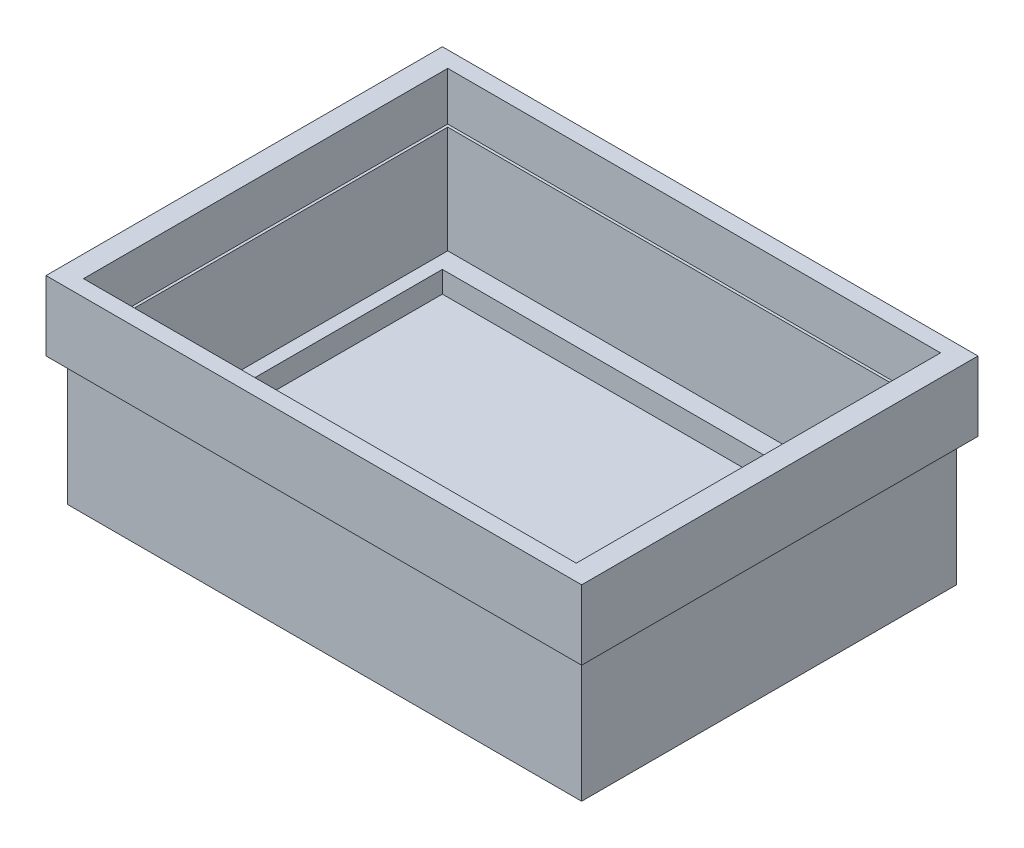
ISO-10303-21;
HEADER;
FILE_DESCRIPTION(('STEP AP214'),'2;1');
FILE_NAME('part.step','',(''),(''),'','','');
FILE_SCHEMA(('AUTOMOTIVE_DESIGN { 1 0 10303 214 1 1 1 1 }'));
ENDSEC;
DATA;
#1=APPLICATION_CONTEXT('core data for automotive mechanical design processes');
#2=APPLICATION_PROTOCOL_DEFINITION('international standard','automotive_design',2000,#1);
#3=PRODUCT_CONTEXT('',#1,'mechanical');
#4=PRODUCT('Part','Part','',(#3));
#5=PRODUCT_RELATED_PRODUCT_CATEGORY('part','',(#4));
#6=PRODUCT_DEFINITION_FORMATION('','',#4);
#7=PRODUCT_DEFINITION_CONTEXT('part definition',#1,'design');
#8=PRODUCT_DEFINITION('design','',#6,#7);
#9=PRODUCT_DEFINITION_SHAPE('','',#8);
#10=(LENGTH_UNIT() NAMED_UNIT(*) SI_UNIT(.MILLI.,.METRE.));
#11=(NAMED_UNIT(*) PLANE_ANGLE_UNIT() SI_UNIT($,.RADIAN.));
#12=(NAMED_UNIT(*) SI_UNIT($,.STERADIAN.) SOLID_ANGLE_UNIT());
#13=UNCERTAINTY_MEASURE_WITH_UNIT(LENGTH_MEASURE(1.E-05),#10,'distance_accuracy_value','');
#14=(GEOMETRIC_REPRESENTATION_CONTEXT(3) GLOBAL_UNCERTAINTY_ASSIGNED_CONTEXT((#13)) GLOBAL_UNIT_ASSIGNED_CONTEXT((#10,
#11,#12)) REPRESENTATION_CONTEXT('',''));
#15=CARTESIAN_POINT('',(0.,0.,0.));
#16=DIRECTION('',(0.,0.,1.));
#17=DIRECTION('',(1.,0.,0.));
#18=AXIS2_PLACEMENT_3D('',#15,#16,#17);
#19=CARTESIAN_POINT('',(0.,120.,0.));
#20=DIRECTION('',(0.,1.,0.));
#21=DIRECTION('',(0.,0.,1.));
#22=AXIS2_PLACEMENT_3D('',#19,#20,#21);
#23=PLANE('',#22);
#24=DIRECTION('',(0.,0.,-1.));
#25=VECTOR('',#24,1.);
#26=CARTESIAN_POINT('',(227.5,120.,167.5));
#27=LINE('',#26,#25);
#28=CARTESIAN_POINT('',(227.5,120.,167.5));
#29=VERTEX_POINT('',#28);
#30=CARTESIAN_POINT('',(227.5,120.,-167.5));
#31=VERTEX_POINT('',#30);
#32=EDGE_CURVE('E55',#29,#31,#27,.T.);
#33=ORIENTED_EDGE('',*,*,#32,.F.);
#34=DIRECTION('',(1.,0.,0.));
#35=VECTOR('',#34,1.);
#36=CARTESIAN_POINT('',(-227.5,120.,167.5));
#37=LINE('',#36,#35);
#38=CARTESIAN_POINT('',(-227.5,120.,167.5));
#39=VERTEX_POINT('',#38);
#40=EDGE_CURVE('E199',#39,#29,#37,.T.);
#41=ORIENTED_EDGE('',*,*,#40,.F.);
#42=DIRECTION('',(0.,0.,1.));
#43=VECTOR('',#42,1.);
#44=CARTESIAN_POINT('',(-227.5,120.,167.5));
#45=LINE('',#44,#43);
#46=CARTESIAN_POINT('',(-227.5,120.,-167.5));
#47=VERTEX_POINT('',#46);
#48=EDGE_CURVE('E203',#47,#39,#45,.T.);
#49=ORIENTED_EDGE('',*,*,#48,.F.);
#50=DIRECTION('',(-1.,0.,0.));
#51=VECTOR('',#50,1.);
#52=CARTESIAN_POINT('',(-227.5,120.,-167.5));
#53=LINE('',#52,#51);
#54=EDGE_CURVE('E212',#31,#47,#53,.T.);
#55=ORIENTED_EDGE('',*,*,#54,.F.);
#56=EDGE_LOOP('',(#33,#41,#49,#55));
#57=FACE_BOUND('',#56,.T.);
#58=DIRECTION('',(1.,0.,0.));
#59=VECTOR('',#58,1.);
#60=CARTESIAN_POINT('',(-230.,120.,170.));
#61=LINE('',#60,#59);
#62=CARTESIAN_POINT('',(-230.,120.,170.));
#63=VERTEX_POINT('',#62);
#64=CARTESIAN_POINT('',(230.,120.,170.));
#65=VERTEX_POINT('',#64);
#66=EDGE_CURVE('E296',#63,#65,#61,.T.);
#67=ORIENTED_EDGE('',*,*,#66,.T.);
#68=DIRECTION('',(0.,0.,-1.));
#69=VECTOR('',#68,1.);
#70=CARTESIAN_POINT('',(230.,120.,-170.));
#71=LINE('',#70,#69);
#72=CARTESIAN_POINT('',(230.,120.,-170.));
#73=VERTEX_POINT('',#72);
#74=EDGE_CURVE('E291',#65,#73,#71,.T.);
#75=ORIENTED_EDGE('',*,*,#74,.T.);
#76=DIRECTION('',(-1.,0.,0.));
#77=VECTOR('',#76,1.);
#78=CARTESIAN_POINT('',(-230.,120.,-170.));
#79=LINE('',#78,#77);
#80=CARTESIAN_POINT('',(-230.,120.,-170.));
#81=VERTEX_POINT('',#80);
#82=EDGE_CURVE('E310',#73,#81,#79,.T.);
#83=ORIENTED_EDGE('',*,*,#82,.T.);
#84=DIRECTION('',(0.,0.,1.));
#85=VECTOR('',#84,1.);
#86=CARTESIAN_POINT('',(-230.,120.,-170.));
#87=LINE('',#86,#85);
#88=EDGE_CURVE('E314',#81,#63,#87,.T.);
#89=ORIENTED_EDGE('',*,*,#88,.T.);
#90=EDGE_LOOP('',(#67,#75,#83,#89));
#91=FACE_BOUND('',#90,.T.);
#92=ADVANCED_FACE('F39',(#57,#91),#23,.T.);
#93=CARTESIAN_POINT('',(250.,120.,-185.));
#94=DIRECTION('',(-1.,0.,0.));
#95=DIRECTION('',(0.,0.,1.));
#96=AXIS2_PLACEMENT_3D('',#93,#94,#95);
#97=PLANE('',#96);
#98=DIRECTION('',(0.,-1.,0.));
#99=VECTOR('',#98,1.);
#100=CARTESIAN_POINT('',(250.,120.,185.));
#101=LINE('',#100,#99);
#102=CARTESIAN_POINT('',(250.,165.,185.));
#103=VERTEX_POINT('',#102);
#104=CARTESIAN_POINT('',(250.,100.,185.));
#105=VERTEX_POINT('',#104);
#106=EDGE_CURVE('E377',#103,#105,#101,.T.);
#107=ORIENTED_EDGE('',*,*,#106,.T.);
#108=DIRECTION('',(0.,0.,1.));
#109=VECTOR('',#108,1.);
#110=CARTESIAN_POINT('',(250.,100.,-185.));
#111=LINE('',#110,#109);
#112=CARTESIAN_POINT('',(250.,100.,-185.));
#113=VERTEX_POINT('',#112);
#114=EDGE_CURVE('E270',#113,#105,#111,.T.);
#115=ORIENTED_EDGE('',*,*,#114,.F.);
#116=DIRECTION('',(0.,-1.,0.));
#117=VECTOR('',#116,1.);
#118=CARTESIAN_POINT('',(250.,120.,-185.));
#119=LINE('',#118,#117);
#120=CARTESIAN_POINT('',(250.,165.,-185.));
#121=VERTEX_POINT('',#120);
#122=EDGE_CURVE('E48',#121,#113,#119,.T.);
#123=ORIENTED_EDGE('',*,*,#122,.F.);
#124=DIRECTION('',(0.,0.,-1.));
#125=VECTOR('',#124,1.);
#126=CARTESIAN_POINT('',(250.,165.,-185.));
#127=LINE('',#126,#125);
#128=EDGE_CURVE('E333',#103,#121,#127,.T.);
#129=ORIENTED_EDGE('',*,*,#128,.F.);
#130=EDGE_LOOP('',(#107,#115,#123,#129));
#131=FACE_BOUND('',#130,.T.);
#132=ADVANCED_FACE('F41',(#131),#97,.F.);
#133=CARTESIAN_POINT('',(-250.,120.,-185.));
#134=DIRECTION('',(0.,0.,1.));
#135=DIRECTION('',(1.,0.,0.));
#136=AXIS2_PLACEMENT_3D('',#133,#134,#135);
#137=PLANE('',#136);
#138=ORIENTED_EDGE('',*,*,#122,.T.);
#139=DIRECTION('',(1.,0.,0.));
#140=VECTOR('',#139,1.);
#141=CARTESIAN_POINT('',(-250.,100.,-185.));
#142=LINE('',#141,#140);
#143=CARTESIAN_POINT('',(-250.,100.,-185.));
#144=VERTEX_POINT('',#143);
#145=EDGE_CURVE('E288',#144,#113,#142,.T.);
#146=ORIENTED_EDGE('',*,*,#145,.F.);
#147=DIRECTION('',(0.,-1.,0.));
#148=VECTOR('',#147,1.);
#149=CARTESIAN_POINT('',(-250.,120.,-185.));
#150=LINE('',#149,#148);
#151=CARTESIAN_POINT('',(-250.,165.,-185.));
#152=VERTEX_POINT('',#151);
#153=EDGE_CURVE('E385',#152,#144,#150,.T.);
#154=ORIENTED_EDGE('',*,*,#153,.F.);
#155=DIRECTION('',(-1.,0.,0.));
#156=VECTOR('',#155,1.);
#157=CARTESIAN_POINT('',(-250.,165.,-185.));
#158=LINE('',#157,#156);
#159=EDGE_CURVE('E337',#121,#152,#158,.T.);
#160=ORIENTED_EDGE('',*,*,#159,.F.);
#161=EDGE_LOOP('',(#138,#146,#154,#160));
#162=FACE_BOUND('',#161,.T.);
#163=ADVANCED_FACE('F393',(#162),#137,.F.);
#164=CARTESIAN_POINT('',(-250.,120.,-185.));
#165=DIRECTION('',(1.,0.,0.));
#166=DIRECTION('',(0.,0.,-1.));
#167=AXIS2_PLACEMENT_3D('',#164,#165,#166);
#168=PLANE('',#167);
#169=ORIENTED_EDGE('',*,*,#153,.T.);
#170=DIRECTION('',(0.,0.,-1.));
#171=VECTOR('',#170,1.);
#172=CARTESIAN_POINT('',(-250.,100.,-185.));
#173=LINE('',#172,#171);
#174=CARTESIAN_POINT('',(-250.,100.,185.));
#175=VERTEX_POINT('',#174);
#176=EDGE_CURVE('E285',#175,#144,#173,.T.);
#177=ORIENTED_EDGE('',*,*,#176,.F.);
#178=DIRECTION('',(0.,-1.,0.));
#179=VECTOR('',#178,1.);
#180=CARTESIAN_POINT('',(-250.,120.,185.));
#181=LINE('',#180,#179);
#182=CARTESIAN_POINT('',(-250.,165.,185.));
#183=VERTEX_POINT('',#182);
#184=EDGE_CURVE('E381',#183,#175,#181,.T.);
#185=ORIENTED_EDGE('',*,*,#184,.F.);
#186=DIRECTION('',(0.,0.,1.));
#187=VECTOR('',#186,1.);
#188=CARTESIAN_POINT('',(-250.,165.,-185.));
#189=LINE('',#188,#187);
#190=EDGE_CURVE('E341',#152,#183,#189,.T.);
#191=ORIENTED_EDGE('',*,*,#190,.F.);
#192=EDGE_LOOP('',(#169,#177,#185,#191));
#193=FACE_BOUND('',#192,.T.);
#194=ADVANCED_FACE('F406',(#193),#168,.F.);
#195=CARTESIAN_POINT('',(-250.,120.,185.));
#196=DIRECTION('',(0.,0.,-1.));
#197=DIRECTION('',(-1.,0.,0.));
#198=AXIS2_PLACEMENT_3D('',#195,#196,#197);
#199=PLANE('',#198);
#200=ORIENTED_EDGE('',*,*,#184,.T.);
#201=DIRECTION('',(-1.,0.,0.));
#202=VECTOR('',#201,1.);
#203=CARTESIAN_POINT('',(-250.,100.,185.));
#204=LINE('',#203,#202);
#205=EDGE_CURVE('E282',#105,#175,#204,.T.);
#206=ORIENTED_EDGE('',*,*,#205,.F.);
#207=ORIENTED_EDGE('',*,*,#106,.F.);
#208=DIRECTION('',(1.,0.,0.));
#209=VECTOR('',#208,1.);
#210=CARTESIAN_POINT('',(-250.,165.,185.));
#211=LINE('',#210,#209);
#212=EDGE_CURVE('E345',#183,#103,#211,.T.);
#213=ORIENTED_EDGE('',*,*,#212,.F.);
#214=EDGE_LOOP('',(#200,#206,#207,#213));
#215=FACE_BOUND('',#214,.T.);
#216=ADVANCED_FACE('F402',(#215),#199,.F.);
#217=CARTESIAN_POINT('',(0.,165.,0.));
#218=DIRECTION('',(0.,1.,0.));
#219=DIRECTION('',(0.,0.,1.));
#220=AXIS2_PLACEMENT_3D('',#217,#218,#219);
#221=PLANE('',#220);
#222=ORIENTED_EDGE('',*,*,#128,.T.);
#223=ORIENTED_EDGE('',*,*,#159,.T.);
#224=ORIENTED_EDGE('',*,*,#190,.T.);
#225=ORIENTED_EDGE('',*,*,#212,.T.);
#226=EDGE_LOOP('',(#222,#223,#224,#225));
#227=FACE_BOUND('',#226,.T.);
#228=DIRECTION('',(-1.,0.,0.));
#229=VECTOR('',#228,1.);
#230=CARTESIAN_POINT('',(-230.,165.,-170.));
#231=LINE('',#230,#229);
#232=CARTESIAN_POINT('',(230.,165.,-170.));
#233=VERTEX_POINT('',#232);
#234=CARTESIAN_POINT('',(-230.,165.,-170.));
#235=VERTEX_POINT('',#234);
#236=EDGE_CURVE('E295',#233,#235,#231,.T.);
#237=ORIENTED_EDGE('',*,*,#236,.F.);
#238=DIRECTION('',(0.,0.,-1.));
#239=VECTOR('',#238,1.);
#240=CARTESIAN_POINT('',(230.,165.,-170.));
#241=LINE('',#240,#239);
#242=CARTESIAN_POINT('',(230.,165.,170.));
#243=VERTEX_POINT('',#242);
#244=EDGE_CURVE('E292',#243,#233,#241,.T.);
#245=ORIENTED_EDGE('',*,*,#244,.F.);
#246=DIRECTION('',(1.,0.,0.));
#247=VECTOR('',#246,1.);
#248=CARTESIAN_POINT('',(-230.,165.,170.));
#249=LINE('',#248,#247);
#250=CARTESIAN_POINT('',(-230.,165.,170.));
#251=VERTEX_POINT('',#250);
#252=EDGE_CURVE('E303',#251,#243,#249,.T.);
#253=ORIENTED_EDGE('',*,*,#252,.F.);
#254=DIRECTION('',(0.,0.,1.));
#255=VECTOR('',#254,1.);
#256=CARTESIAN_POINT('',(-230.,165.,-170.));
#257=LINE('',#256,#255);
#258=EDGE_CURVE('E299',#235,#251,#257,.T.);
#259=ORIENTED_EDGE('',*,*,#258,.F.);
#260=EDGE_LOOP('',(#237,#245,#253,#259));
#261=FACE_BOUND('',#260,.T.);
#262=ADVANCED_FACE('F408',(#227,#261),#221,.T.);
#263=CARTESIAN_POINT('',(230.,165.,-170.));
#264=DIRECTION('',(-1.,0.,0.));
#265=DIRECTION('',(0.,0.,1.));
#266=AXIS2_PLACEMENT_3D('',#263,#264,#265);
#267=PLANE('',#266);
#268=ORIENTED_EDGE('',*,*,#74,.F.);
#269=DIRECTION('',(0.,-1.,0.));
#270=VECTOR('',#269,1.);
#271=CARTESIAN_POINT('',(230.,165.,170.));
#272=LINE('',#271,#270);
#273=EDGE_CURVE('E306',#243,#65,#272,.T.);
#274=ORIENTED_EDGE('',*,*,#273,.F.);
#275=ORIENTED_EDGE('',*,*,#244,.T.);
#276=DIRECTION('',(0.,-1.,0.));
#277=VECTOR('',#276,1.);
#278=CARTESIAN_POINT('',(230.,165.,-170.));
#279=LINE('',#278,#277);
#280=EDGE_CURVE('E329',#233,#73,#279,.T.);
#281=ORIENTED_EDGE('',*,*,#280,.T.);
#282=EDGE_LOOP('',(#268,#274,#275,#281));
#283=FACE_BOUND('',#282,.T.);
#284=ADVANCED_FACE('F411',(#283),#267,.T.);
#285=CARTESIAN_POINT('',(-230.,165.,-170.));
#286=DIRECTION('',(0.,0.,1.));
#287=DIRECTION('',(1.,0.,0.));
#288=AXIS2_PLACEMENT_3D('',#285,#286,#287);
#289=PLANE('',#288);
#290=ORIENTED_EDGE('',*,*,#82,.F.);
#291=ORIENTED_EDGE('',*,*,#280,.F.);
#292=ORIENTED_EDGE('',*,*,#236,.T.);
#293=DIRECTION('',(0.,-1.,0.));
#294=VECTOR('',#293,1.);
#295=CARTESIAN_POINT('',(-230.,165.,-170.));
#296=LINE('',#295,#294);
#297=EDGE_CURVE('E326',#235,#81,#296,.T.);
#298=ORIENTED_EDGE('',*,*,#297,.T.);
#299=EDGE_LOOP('',(#290,#291,#292,#298));
#300=FACE_BOUND('',#299,.T.);
#301=ADVANCED_FACE('F420',(#300),#289,.T.);
#302=CARTESIAN_POINT('',(-230.,165.,-170.));
#303=DIRECTION('',(1.,0.,0.));
#304=DIRECTION('',(0.,0.,-1.));
#305=AXIS2_PLACEMENT_3D('',#302,#303,#304);
#306=PLANE('',#305);
#307=ORIENTED_EDGE('',*,*,#88,.F.);
#308=ORIENTED_EDGE('',*,*,#297,.F.);
#309=ORIENTED_EDGE('',*,*,#258,.T.);
#310=DIRECTION('',(0.,-1.,0.));
#311=VECTOR('',#310,1.);
#312=CARTESIAN_POINT('',(-230.,165.,170.));
#313=LINE('',#312,#311);
#314=EDGE_CURVE('E323',#251,#63,#313,.T.);
#315=ORIENTED_EDGE('',*,*,#314,.T.);
#316=EDGE_LOOP('',(#307,#308,#309,#315));
#317=FACE_BOUND('',#316,.T.);
#318=ADVANCED_FACE('F423',(#317),#306,.T.);
#319=CARTESIAN_POINT('',(-230.,165.,170.));
#320=DIRECTION('',(0.,0.,-1.));
#321=DIRECTION('',(-1.,0.,0.));
#322=AXIS2_PLACEMENT_3D('',#319,#320,#321);
#323=PLANE('',#322);
#324=ORIENTED_EDGE('',*,*,#66,.F.);
#325=ORIENTED_EDGE('',*,*,#314,.F.);
#326=ORIENTED_EDGE('',*,*,#252,.T.);
#327=ORIENTED_EDGE('',*,*,#273,.T.);
#328=EDGE_LOOP('',(#324,#325,#326,#327));
#329=FACE_BOUND('',#328,.T.);
#330=ADVANCED_FACE('F430',(#329),#323,.T.);
#331=CARTESIAN_POINT('',(0.,100.,0.));
#332=DIRECTION('',(0.,1.,0.));
#333=DIRECTION('',(0.,0.,1.));
#334=AXIS2_PLACEMENT_3D('',#331,#332,#333);
#335=PLANE('',#334);
#336=DIRECTION('',(0.,0.,1.));
#337=VECTOR('',#336,1.);
#338=CARTESIAN_POINT('',(240.,100.,-175.));
#339=LINE('',#338,#337);
#340=CARTESIAN_POINT('',(240.,100.,-175.));
#341=VERTEX_POINT('',#340);
#342=CARTESIAN_POINT('',(240.,100.,175.));
#343=VERTEX_POINT('',#342);
#344=EDGE_CURVE('E235',#341,#343,#339,.T.);
#345=ORIENTED_EDGE('',*,*,#344,.F.);
#346=DIRECTION('',(1.,0.,0.));
#347=VECTOR('',#346,1.);
#348=CARTESIAN_POINT('',(-240.,100.,-175.));
#349=LINE('',#348,#347);
#350=CARTESIAN_POINT('',(-240.,100.,-175.));
#351=VERTEX_POINT('',#350);
#352=EDGE_CURVE('E248',#351,#341,#349,.T.);
#353=ORIENTED_EDGE('',*,*,#352,.F.);
#354=DIRECTION('',(0.,0.,-1.));
#355=VECTOR('',#354,1.);
#356=CARTESIAN_POINT('',(-240.,100.,-175.));
#357=LINE('',#356,#355);
#358=CARTESIAN_POINT('',(-240.,100.,175.));
#359=VERTEX_POINT('',#358);
#360=EDGE_CURVE('E244',#359,#351,#357,.T.);
#361=ORIENTED_EDGE('',*,*,#360,.F.);
#362=DIRECTION('',(-1.,0.,0.));
#363=VECTOR('',#362,1.);
#364=CARTESIAN_POINT('',(-240.,100.,175.));
#365=LINE('',#364,#363);
#366=EDGE_CURVE('E239',#343,#359,#365,.T.);
#367=ORIENTED_EDGE('',*,*,#366,.F.);
#368=EDGE_LOOP('',(#345,#353,#361,#367));
#369=FACE_BOUND('',#368,.T.);
#370=ORIENTED_EDGE('',*,*,#114,.T.);
#371=ORIENTED_EDGE('',*,*,#205,.T.);
#372=ORIENTED_EDGE('',*,*,#176,.T.);
#373=ORIENTED_EDGE('',*,*,#145,.T.);
#374=EDGE_LOOP('',(#370,#371,#372,#373));
#375=FACE_BOUND('',#374,.T.);
#376=ADVANCED_FACE('F399',(#369,#375),#335,.F.);
#377=CARTESIAN_POINT('',(240.,100.,-175.));
#378=DIRECTION('',(1.,0.,0.));
#379=DIRECTION('',(0.,0.,-1.));
#380=AXIS2_PLACEMENT_3D('',#377,#378,#379);
#381=PLANE('',#380);
#382=DIRECTION('',(0.,0.,1.));
#383=VECTOR('',#382,1.);
#384=CARTESIAN_POINT('',(240.,-20.,-175.));
#385=LINE('',#384,#383);
#386=CARTESIAN_POINT('',(240.,-20.,-175.));
#387=VERTEX_POINT('',#386);
#388=CARTESIAN_POINT('',(240.,-20.,175.));
#389=VERTEX_POINT('',#388);
#390=EDGE_CURVE('E234',#387,#389,#385,.T.);
#391=ORIENTED_EDGE('',*,*,#390,.F.);
#392=DIRECTION('',(0.,-1.,0.));
#393=VECTOR('',#392,1.);
#394=CARTESIAN_POINT('',(240.,100.,-175.));
#395=LINE('',#394,#393);
#396=EDGE_CURVE('E267',#341,#387,#395,.T.);
#397=ORIENTED_EDGE('',*,*,#396,.F.);
#398=ORIENTED_EDGE('',*,*,#344,.T.);
#399=DIRECTION('',(0.,-1.,0.));
#400=VECTOR('',#399,1.);
#401=CARTESIAN_POINT('',(240.,100.,175.));
#402=LINE('',#401,#400);
#403=EDGE_CURVE('E252',#343,#389,#402,.T.);
#404=ORIENTED_EDGE('',*,*,#403,.T.);
#405=EDGE_LOOP('',(#391,#397,#398,#404));
#406=FACE_BOUND('',#405,.T.);
#407=ADVANCED_FACE('F437',(#406),#381,.T.);
#408=CARTESIAN_POINT('',(-240.,100.,-175.));
#409=DIRECTION('',(0.,0.,-1.));
#410=DIRECTION('',(-1.,0.,0.));
#411=AXIS2_PLACEMENT_3D('',#408,#409,#410);
#412=PLANE('',#411);
#413=DIRECTION('',(1.,0.,0.));
#414=VECTOR('',#413,1.);
#415=CARTESIAN_POINT('',(-240.,-20.,-175.));
#416=LINE('',#415,#414);
#417=CARTESIAN_POINT('',(-240.,-20.,-175.));
#418=VERTEX_POINT('',#417);
#419=EDGE_CURVE('E240',#418,#387,#416,.T.);
#420=ORIENTED_EDGE('',*,*,#419,.F.);
#421=DIRECTION('',(0.,-1.,0.));
#422=VECTOR('',#421,1.);
#423=CARTESIAN_POINT('',(-240.,100.,-175.));
#424=LINE('',#423,#422);
#425=EDGE_CURVE('E271',#351,#418,#424,.T.);
#426=ORIENTED_EDGE('',*,*,#425,.F.);
#427=ORIENTED_EDGE('',*,*,#352,.T.);
#428=ORIENTED_EDGE('',*,*,#396,.T.);
#429=EDGE_LOOP('',(#420,#426,#427,#428));
#430=FACE_BOUND('',#429,.T.);
#431=ADVANCED_FACE('F631',(#430),#412,.T.);
#432=CARTESIAN_POINT('',(-240.,100.,-175.));
#433=DIRECTION('',(-1.,0.,0.));
#434=DIRECTION('',(0.,0.,1.));
#435=AXIS2_PLACEMENT_3D('',#432,#433,#434);
#436=PLANE('',#435);
#437=DIRECTION('',(0.,0.,-1.));
#438=VECTOR('',#437,1.);
#439=CARTESIAN_POINT('',(-240.,-20.,-175.));
#440=LINE('',#439,#438);
#441=CARTESIAN_POINT('',(-240.,-20.,175.));
#442=VERTEX_POINT('',#441);
#443=EDGE_CURVE('E260',#442,#418,#440,.T.);
#444=ORIENTED_EDGE('',*,*,#443,.F.);
#445=DIRECTION('',(0.,-1.,0.));
#446=VECTOR('',#445,1.);
#447=CARTESIAN_POINT('',(-240.,100.,175.));
#448=LINE('',#447,#446);
#449=EDGE_CURVE('E274',#359,#442,#448,.T.);
#450=ORIENTED_EDGE('',*,*,#449,.F.);
#451=ORIENTED_EDGE('',*,*,#360,.T.);
#452=ORIENTED_EDGE('',*,*,#425,.T.);
#453=EDGE_LOOP('',(#444,#450,#451,#452));
#454=FACE_BOUND('',#453,.T.);
#455=ADVANCED_FACE('F634',(#454),#436,.T.);
#456=CARTESIAN_POINT('',(-240.,100.,175.));
#457=DIRECTION('',(0.,0.,1.));
#458=DIRECTION('',(1.,0.,0.));
#459=AXIS2_PLACEMENT_3D('',#456,#457,#458);
#460=PLANE('',#459);
#461=DIRECTION('',(-1.,0.,0.));
#462=VECTOR('',#461,1.);
#463=CARTESIAN_POINT('',(-240.,-20.,175.));
#464=LINE('',#463,#462);
#465=EDGE_CURVE('E256',#389,#442,#464,.T.);
#466=ORIENTED_EDGE('',*,*,#465,.F.);
#467=ORIENTED_EDGE('',*,*,#403,.F.);
#468=ORIENTED_EDGE('',*,*,#366,.T.);
#469=ORIENTED_EDGE('',*,*,#449,.T.);
#470=EDGE_LOOP('',(#466,#467,#468,#469));
#471=FACE_BOUND('',#470,.T.);
#472=ADVANCED_FACE('F638',(#471),#460,.T.);
#473=CARTESIAN_POINT('',(0.,-20.,0.));
#474=DIRECTION('',(0.,1.,0.));
#475=DIRECTION('',(0.,0.,1.));
#476=AXIS2_PLACEMENT_3D('',#473,#474,#475);
#477=PLANE('',#476);
#478=ORIENTED_EDGE('',*,*,#390,.T.);
#479=ORIENTED_EDGE('',*,*,#465,.T.);
#480=ORIENTED_EDGE('',*,*,#443,.T.);
#481=ORIENTED_EDGE('',*,*,#419,.T.);
#482=EDGE_LOOP('',(#478,#479,#480,#481));
#483=FACE_BOUND('',#482,.T.);
#484=ADVANCED_FACE('F584',(#483),#477,.F.);
#485=CARTESIAN_POINT('',(227.5,20.,167.5));
#486=DIRECTION('',(1.,0.,0.));
#487=DIRECTION('',(0.,0.,-1.));
#488=AXIS2_PLACEMENT_3D('',#485,#486,#487);
#489=PLANE('',#488);
#490=ORIENTED_EDGE('',*,*,#32,.T.);
#491=DIRECTION('',(0.,1.,0.));
#492=VECTOR('',#491,1.);
#493=CARTESIAN_POINT('',(227.5,20.,-167.5));
#494=LINE('',#493,#492);
#495=CARTESIAN_POINT('',(227.5,20.,-167.5));
#496=VERTEX_POINT('',#495);
#497=EDGE_CURVE('E174',#496,#31,#494,.T.);
#498=ORIENTED_EDGE('',*,*,#497,.F.);
#499=DIRECTION('',(0.,0.,-1.));
#500=VECTOR('',#499,1.);
#501=CARTESIAN_POINT('',(227.5,20.,167.5));
#502=LINE('',#501,#500);
#503=CARTESIAN_POINT('',(227.5,20.,167.5));
#504=VERTEX_POINT('',#503);
#505=EDGE_CURVE('E178',#504,#496,#502,.T.);
#506=ORIENTED_EDGE('',*,*,#505,.F.);
#507=DIRECTION('',(0.,1.,0.));
#508=VECTOR('',#507,1.);
#509=CARTESIAN_POINT('',(227.5,20.,167.5));
#510=LINE('',#509,#508);
#511=EDGE_CURVE('E218',#504,#29,#510,.T.);
#512=ORIENTED_EDGE('',*,*,#511,.T.);
#513=EDGE_LOOP('',(#490,#498,#506,#512));
#514=FACE_BOUND('',#513,.T.);
#515=ADVANCED_FACE('F176',(#514),#489,.F.);
#516=CARTESIAN_POINT('',(-227.5,20.,167.5));
#517=DIRECTION('',(0.,0.,1.));
#518=DIRECTION('',(1.,0.,0.));
#519=AXIS2_PLACEMENT_3D('',#516,#517,#518);
#520=PLANE('',#519);
#521=ORIENTED_EDGE('',*,*,#40,.T.);
#522=ORIENTED_EDGE('',*,*,#511,.F.);
#523=DIRECTION('',(1.,0.,0.));
#524=VECTOR('',#523,1.);
#525=CARTESIAN_POINT('',(-227.5,20.,167.5));
#526=LINE('',#525,#524);
#527=CARTESIAN_POINT('',(-227.5,20.,167.5));
#528=VERTEX_POINT('',#527);
#529=EDGE_CURVE('E185',#528,#504,#526,.T.);
#530=ORIENTED_EDGE('',*,*,#529,.F.);
#531=DIRECTION('',(0.,1.,0.));
#532=VECTOR('',#531,1.);
#533=CARTESIAN_POINT('',(-227.5,20.,167.5));
#534=LINE('',#533,#532);
#535=EDGE_CURVE('E222',#528,#39,#534,.T.);
#536=ORIENTED_EDGE('',*,*,#535,.T.);
#537=EDGE_LOOP('',(#521,#522,#530,#536));
#538=FACE_BOUND('',#537,.T.);
#539=ADVANCED_FACE('F592',(#538),#520,.F.);
#540=CARTESIAN_POINT('',(-227.5,20.,167.5));
#541=DIRECTION('',(-1.,0.,0.));
#542=DIRECTION('',(0.,0.,1.));
#543=AXIS2_PLACEMENT_3D('',#540,#541,#542);
#544=PLANE('',#543);
#545=ORIENTED_EDGE('',*,*,#48,.T.);
#546=ORIENTED_EDGE('',*,*,#535,.F.);
#547=DIRECTION('',(0.,0.,1.));
#548=VECTOR('',#547,1.);
#549=CARTESIAN_POINT('',(-227.5,20.,167.5));
#550=LINE('',#549,#548);
#551=CARTESIAN_POINT('',(-227.5,20.,-167.5));
#552=VERTEX_POINT('',#551);
#553=EDGE_CURVE('E194',#552,#528,#550,.T.);
#554=ORIENTED_EDGE('',*,*,#553,.F.);
#555=DIRECTION('',(0.,1.,0.));
#556=VECTOR('',#555,1.);
#557=CARTESIAN_POINT('',(-227.5,20.,-167.5));
#558=LINE('',#557,#556);
#559=EDGE_CURVE('E184',#552,#47,#558,.T.);
#560=ORIENTED_EDGE('',*,*,#559,.T.);
#561=EDGE_LOOP('',(#545,#546,#554,#560));
#562=FACE_BOUND('',#561,.T.);
#563=ADVANCED_FACE('F602',(#562),#544,.F.);
#564=CARTESIAN_POINT('',(-227.5,20.,-167.5));
#565=DIRECTION('',(0.,0.,-1.));
#566=DIRECTION('',(-1.,0.,0.));
#567=AXIS2_PLACEMENT_3D('',#564,#565,#566);
#568=PLANE('',#567);
#569=ORIENTED_EDGE('',*,*,#54,.T.);
#570=ORIENTED_EDGE('',*,*,#559,.F.);
#571=DIRECTION('',(-1.,0.,0.));
#572=VECTOR('',#571,1.);
#573=CARTESIAN_POINT('',(-227.5,20.,-167.5));
#574=LINE('',#573,#572);
#575=EDGE_CURVE('E188',#496,#552,#574,.T.);
#576=ORIENTED_EDGE('',*,*,#575,.F.);
#577=ORIENTED_EDGE('',*,*,#497,.T.);
#578=EDGE_LOOP('',(#569,#570,#576,#577));
#579=FACE_BOUND('',#578,.T.);
#580=ADVANCED_FACE('F189',(#579),#568,.F.);
#581=CARTESIAN_POINT('',(0.,20.,0.));
#582=DIRECTION('',(0.,-1.,0.));
#583=DIRECTION('',(0.,0.,-1.));
#584=AXIS2_PLACEMENT_3D('',#581,#582,#583);
#585=PLANE('',#584);
#586=DIRECTION('',(0.,0.,1.));
#587=VECTOR('',#586,1.);
#588=CARTESIAN_POINT('',(215.,20.,-150.));
#589=LINE('',#588,#587);
#590=CARTESIAN_POINT('',(215.,20.,-150.));
#591=VERTEX_POINT('',#590);
#592=CARTESIAN_POINT('',(215.,20.,150.));
#593=VERTEX_POINT('',#592);
#594=EDGE_CURVE('E62',#591,#593,#589,.T.);
#595=ORIENTED_EDGE('',*,*,#594,.T.);
#596=DIRECTION('',(-1.,0.,0.));
#597=VECTOR('',#596,1.);
#598=CARTESIAN_POINT('',(-215.,20.,150.));
#599=LINE('',#598,#597);
#600=CARTESIAN_POINT('',(-215.,20.,150.));
#601=VERTEX_POINT('',#600);
#602=EDGE_CURVE('E11',#593,#601,#599,.T.);
#603=ORIENTED_EDGE('',*,*,#602,.T.);
#604=DIRECTION('',(0.,0.,-1.));
#605=VECTOR('',#604,1.);
#606=CARTESIAN_POINT('',(-215.,20.,-150.));
#607=LINE('',#606,#605);
#608=CARTESIAN_POINT('',(-215.,20.,-150.));
#609=VERTEX_POINT('',#608);
#610=EDGE_CURVE('E221',#601,#609,#607,.T.);
#611=ORIENTED_EDGE('',*,*,#610,.T.);
#612=DIRECTION('',(1.,0.,0.));
#613=VECTOR('',#612,1.);
#614=CARTESIAN_POINT('',(-215.,20.,-150.));
#615=LINE('',#614,#613);
#616=EDGE_CURVE('E229',#609,#591,#615,.T.);
#617=ORIENTED_EDGE('',*,*,#616,.T.);
#618=EDGE_LOOP('',(#595,#603,#611,#617));
#619=FACE_BOUND('',#618,.T.);
#620=ORIENTED_EDGE('',*,*,#505,.T.);
#621=ORIENTED_EDGE('',*,*,#575,.T.);
#622=ORIENTED_EDGE('',*,*,#553,.T.);
#623=ORIENTED_EDGE('',*,*,#529,.T.);
#624=EDGE_LOOP('',(#620,#621,#622,#623));
#625=FACE_BOUND('',#624,.T.);
#626=ADVANCED_FACE('F196',(#619,#625),#585,.F.);
#627=CARTESIAN_POINT('',(0.,0.,0.));
#628=DIRECTION('',(0.,1.,0.));
#629=DIRECTION('',(0.,0.,1.));
#630=AXIS2_PLACEMENT_3D('',#627,#628,#629);
#631=PLANE('',#630);
#632=DIRECTION('',(1.,0.,0.));
#633=VECTOR('',#632,1.);
#634=CARTESIAN_POINT('',(-215.,0.,150.));
#635=LINE('',#634,#633);
#636=CARTESIAN_POINT('',(-215.,0.,150.));
#637=VERTEX_POINT('',#636);
#638=CARTESIAN_POINT('',(215.,0.,150.));
#639=VERTEX_POINT('',#638);
#640=EDGE_CURVE('E361',#637,#639,#635,.T.);
#641=ORIENTED_EDGE('',*,*,#640,.T.);
#642=DIRECTION('',(0.,0.,-1.));
#643=VECTOR('',#642,1.);
#644=CARTESIAN_POINT('',(215.,0.,-150.));
#645=LINE('',#644,#643);
#646=CARTESIAN_POINT('',(215.,0.,-150.));
#647=VERTEX_POINT('',#646);
#648=EDGE_CURVE('E349',#639,#647,#645,.T.);
#649=ORIENTED_EDGE('',*,*,#648,.T.);
#650=DIRECTION('',(-1.,0.,0.));
#651=VECTOR('',#650,1.);
#652=CARTESIAN_POINT('',(-215.,0.,-150.));
#653=LINE('',#652,#651);
#654=CARTESIAN_POINT('',(-215.,0.,-150.));
#655=VERTEX_POINT('',#654);
#656=EDGE_CURVE('E353',#647,#655,#653,.T.);
#657=ORIENTED_EDGE('',*,*,#656,.T.);
#658=DIRECTION('',(0.,0.,1.));
#659=VECTOR('',#658,1.);
#660=CARTESIAN_POINT('',(-215.,0.,-150.));
#661=LINE('',#660,#659);
#662=EDGE_CURVE('E357',#655,#637,#661,.T.);
#663=ORIENTED_EDGE('',*,*,#662,.T.);
#664=EDGE_LOOP('',(#641,#649,#657,#663));
#665=FACE_BOUND('',#664,.T.);
#666=ADVANCED_FACE('F499',(#665),#631,.T.);
#667=CARTESIAN_POINT('',(-215.,120.,150.));
#668=DIRECTION('',(0.,0.,-1.));
#669=DIRECTION('',(-1.,0.,0.));
#670=AXIS2_PLACEMENT_3D('',#667,#668,#669);
#671=PLANE('',#670);
#672=ORIENTED_EDGE('',*,*,#602,.F.);
#673=DIRECTION('',(0.,-1.,0.));
#674=VECTOR('',#673,1.);
#675=CARTESIAN_POINT('',(215.,120.,150.));
#676=LINE('',#675,#674);
#677=EDGE_CURVE('E365',#593,#639,#676,.T.);
#678=ORIENTED_EDGE('',*,*,#677,.T.);
#679=ORIENTED_EDGE('',*,*,#640,.F.);
#680=DIRECTION('',(0.,-1.,0.));
#681=VECTOR('',#680,1.);
#682=CARTESIAN_POINT('',(-215.,120.,150.));
#683=LINE('',#682,#681);
#684=EDGE_CURVE('E368',#601,#637,#683,.T.);
#685=ORIENTED_EDGE('',*,*,#684,.F.);
#686=EDGE_LOOP('',(#672,#678,#679,#685));
#687=FACE_BOUND('',#686,.T.);
#688=ADVANCED_FACE('F503',(#687),#671,.T.);
#689=CARTESIAN_POINT('',(-215.,120.,-150.));
#690=DIRECTION('',(1.,0.,0.));
#691=DIRECTION('',(0.,0.,-1.));
#692=AXIS2_PLACEMENT_3D('',#689,#690,#691);
#693=PLANE('',#692);
#694=ORIENTED_EDGE('',*,*,#610,.F.);
#695=ORIENTED_EDGE('',*,*,#684,.T.);
#696=ORIENTED_EDGE('',*,*,#662,.F.);
#697=DIRECTION('',(0.,-1.,0.));
#698=VECTOR('',#697,1.);
#699=CARTESIAN_POINT('',(-215.,120.,-150.));
#700=LINE('',#699,#698);
#701=EDGE_CURVE('E371',#609,#655,#700,.T.);
#702=ORIENTED_EDGE('',*,*,#701,.F.);
#703=EDGE_LOOP('',(#694,#695,#696,#702));
#704=FACE_BOUND('',#703,.T.);
#705=ADVANCED_FACE('F561',(#704),#693,.T.);
#706=CARTESIAN_POINT('',(-215.,120.,-150.));
#707=DIRECTION('',(0.,0.,1.));
#708=DIRECTION('',(1.,0.,0.));
#709=AXIS2_PLACEMENT_3D('',#706,#707,#708);
#710=PLANE('',#709);
#711=ORIENTED_EDGE('',*,*,#616,.F.);
#712=ORIENTED_EDGE('',*,*,#701,.T.);
#713=ORIENTED_EDGE('',*,*,#656,.F.);
#714=DIRECTION('',(0.,-1.,0.));
#715=VECTOR('',#714,1.);
#716=CARTESIAN_POINT('',(215.,120.,-150.));
#717=LINE('',#716,#715);
#718=EDGE_CURVE('E374',#591,#647,#717,.T.);
#719=ORIENTED_EDGE('',*,*,#718,.F.);
#720=EDGE_LOOP('',(#711,#712,#713,#719));
#721=FACE_BOUND('',#720,.T.);
#722=ADVANCED_FACE('F553',(#721),#710,.T.);
#723=CARTESIAN_POINT('',(215.,120.,-150.));
#724=DIRECTION('',(-1.,0.,0.));
#725=DIRECTION('',(0.,0.,1.));
#726=AXIS2_PLACEMENT_3D('',#723,#724,#725);
#727=PLANE('',#726);
#728=ORIENTED_EDGE('',*,*,#594,.F.);
#729=ORIENTED_EDGE('',*,*,#718,.T.);
#730=ORIENTED_EDGE('',*,*,#648,.F.);
#731=ORIENTED_EDGE('',*,*,#677,.F.);
#732=EDGE_LOOP('',(#728,#729,#730,#731));
#733=FACE_BOUND('',#732,.T.);
#734=ADVANCED_FACE('F450',(#733),#727,.T.);
#735=CLOSED_SHELL('',(#92,#132,#163,#194,#216,#262,#284,#301,#318,#330,#376,#407,#431,#455,#472,
#484,#515,#539,#563,#580,#626,#666,#688,#705,#722,#734));
#736=MANIFOLD_SOLID_BREP('B2',#735);
#737=ADVANCED_BREP_SHAPE_REPRESENTATION('',(#18,#736),#14);
#738=SHAPE_DEFINITION_REPRESENTATION(#9,#737);
ENDSEC;
END-ISO-10303-21;
